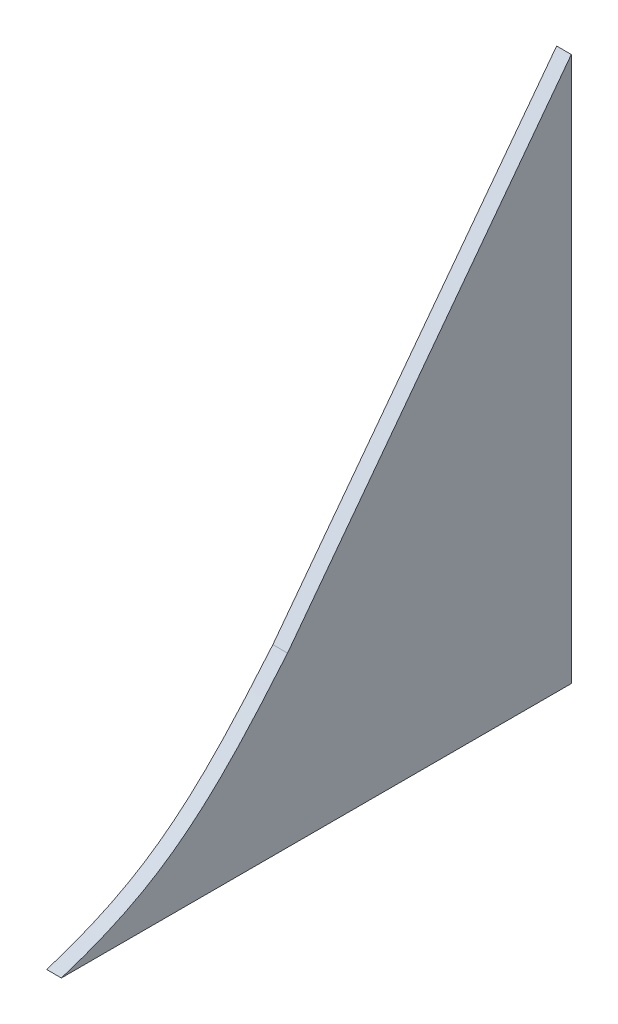
ISO-10303-21;
HEADER;
FILE_DESCRIPTION(('STEP AP214'),'2;1');
FILE_NAME('part.step','',(''),(''),'','','');
FILE_SCHEMA(('AUTOMOTIVE_DESIGN { 1 0 10303 214 1 1 1 1 }'));
ENDSEC;
DATA;
#1=APPLICATION_CONTEXT('core data for automotive mechanical design processes');
#2=APPLICATION_PROTOCOL_DEFINITION('international standard','automotive_design',2000,#1);
#3=PRODUCT_CONTEXT('',#1,'mechanical');
#4=PRODUCT('Part','Part','',(#3));
#5=PRODUCT_RELATED_PRODUCT_CATEGORY('part','',(#4));
#6=PRODUCT_DEFINITION_FORMATION('','',#4);
#7=PRODUCT_DEFINITION_CONTEXT('part definition',#1,'design');
#8=PRODUCT_DEFINITION('design','',#6,#7);
#9=PRODUCT_DEFINITION_SHAPE('','',#8);
#10=(LENGTH_UNIT() NAMED_UNIT(*) SI_UNIT(.MILLI.,.METRE.));
#11=(NAMED_UNIT(*) PLANE_ANGLE_UNIT() SI_UNIT($,.RADIAN.));
#12=(NAMED_UNIT(*) SI_UNIT($,.STERADIAN.) SOLID_ANGLE_UNIT());
#13=UNCERTAINTY_MEASURE_WITH_UNIT(LENGTH_MEASURE(1.E-05),#10,'distance_accuracy_value','');
#14=(GEOMETRIC_REPRESENTATION_CONTEXT(3) GLOBAL_UNCERTAINTY_ASSIGNED_CONTEXT((#13)) GLOBAL_UNIT_ASSIGNED_CONTEXT((#10,
#11,#12)) REPRESENTATION_CONTEXT('',''));
#15=CARTESIAN_POINT('',(0.,0.,0.));
#16=DIRECTION('',(0.,0.,1.));
#17=DIRECTION('',(1.,0.,0.));
#18=AXIS2_PLACEMENT_3D('',#15,#16,#17);
#19=CARTESIAN_POINT('',(2.667,99.06,114.3));
#20=DIRECTION('',(0.,-0.601815023152049,-0.798635510047292));
#21=DIRECTION('',(0.,0.798635510047292,-0.601815023152049));
#22=AXIS2_PLACEMENT_3D('',#19,#20,#21);
#23=PLANE('',#22);
#24=DIRECTION('',(0.,-0.798635510047292,0.601815023152049));
#25=VECTOR('',#24,1.);
#26=CARTESIAN_POINT('',(0.,99.06,114.3));
#27=LINE('',#26,#25);
#28=CARTESIAN_POINT('',(0.,99.06,114.3));
#29=VERTEX_POINT('',#28);
#30=CARTESIAN_POINT('',(0.,30.5969709011959,165.890592859709));
#31=VERTEX_POINT('',#30);
#32=EDGE_CURVE('E98',#29,#31,#27,.T.);
#33=ORIENTED_EDGE('',*,*,#32,.T.);
#34=DIRECTION('',(-1.,0.,0.));
#35=VECTOR('',#34,1.);
#36=CARTESIAN_POINT('',(2.667,30.5969709011959,165.890592859709));
#37=LINE('',#36,#35);
#38=CARTESIAN_POINT('',(2.667,30.5969709011959,165.890592859709));
#39=VERTEX_POINT('',#38);
#40=EDGE_CURVE('E11',#39,#31,#37,.T.);
#41=ORIENTED_EDGE('',*,*,#40,.F.);
#42=DIRECTION('',(0.,-0.798635510047292,0.601815023152049));
#43=VECTOR('',#42,1.);
#44=CARTESIAN_POINT('',(2.667,99.06,114.3));
#45=LINE('',#44,#43);
#46=CARTESIAN_POINT('',(2.667,99.06,114.3));
#47=VERTEX_POINT('',#46);
#48=EDGE_CURVE('E83',#47,#39,#45,.T.);
#49=ORIENTED_EDGE('',*,*,#48,.F.);
#50=DIRECTION('',(-1.,0.,0.));
#51=VECTOR('',#50,1.);
#52=CARTESIAN_POINT('',(2.667,99.06,114.3));
#53=LINE('',#52,#51);
#54=EDGE_CURVE('E91',#47,#29,#53,.T.);
#55=ORIENTED_EDGE('',*,*,#54,.T.);
#56=EDGE_LOOP('',(#33,#41,#49,#55));
#57=FACE_BOUND('',#56,.T.);
#58=ADVANCED_FACE('F32',(#57),#23,.F.);
#59=CARTESIAN_POINT('',(2.667,30.5969709011959,165.890592859709));
#60=CARTESIAN_POINT('',(2.667,13.6197186510497,180.09524478205));
#61=CARTESIAN_POINT('',(2.667,5.8017563901374,188.626978320469));
#62=CARTESIAN_POINT('',(2.667,0.,207.01));
#63=B_SPLINE_CURVE_WITH_KNOTS('',3,(#59,#60,#61,#62),.UNSPECIFIED.,.F.,.F.,(4,4),(0.,1.),.UNSPECIFIED.);
#64=DIRECTION('',(-1.,0.,0.));
#65=VECTOR('',#64,1.);
#66=SURFACE_OF_LINEAR_EXTRUSION('',#63,#65);
#67=CARTESIAN_POINT('',(0.,30.5969709011959,165.890592859709));
#68=CARTESIAN_POINT('',(0.,13.6197186510497,180.09524478205));
#69=CARTESIAN_POINT('',(0.,5.8017563901374,188.626978320469));
#70=CARTESIAN_POINT('',(0.,0.,207.01));
#71=B_SPLINE_CURVE_WITH_KNOTS('',3,(#67,#68,#69,#70),.UNSPECIFIED.,.F.,.F.,(4,4),(0.,1.),.UNSPECIFIED.);
#72=CARTESIAN_POINT('',(0.,0.,207.01));
#73=VERTEX_POINT('',#72);
#74=EDGE_CURVE('E87',#31,#73,#71,.T.);
#75=ORIENTED_EDGE('',*,*,#74,.T.);
#76=DIRECTION('',(-1.,0.,0.));
#77=VECTOR('',#76,1.);
#78=CARTESIAN_POINT('',(2.667,0.,207.01));
#79=LINE('',#78,#77);
#80=CARTESIAN_POINT('',(2.667,0.,207.01));
#81=VERTEX_POINT('',#80);
#82=EDGE_CURVE('E40',#81,#73,#79,.T.);
#83=ORIENTED_EDGE('',*,*,#82,.F.);
#84=EDGE_CURVE('E78',#39,#81,#63,.T.);
#85=ORIENTED_EDGE('',*,*,#84,.F.);
#86=ORIENTED_EDGE('',*,*,#40,.T.);
#87=EDGE_LOOP('',(#75,#83,#85,#86));
#88=FACE_BOUND('',#87,.T.);
#89=ADVANCED_FACE('F86',(#88),#66,.F.);
#90=CARTESIAN_POINT('',(2.667,0.,114.3));
#91=DIRECTION('',(0.,1.,0.));
#92=DIRECTION('',(0.,0.,1.));
#93=AXIS2_PLACEMENT_3D('',#90,#91,#92);
#94=PLANE('',#93);
#95=DIRECTION('',(0.,0.,-1.));
#96=VECTOR('',#95,1.);
#97=CARTESIAN_POINT('',(0.,0.,114.3));
#98=LINE('',#97,#96);
#99=CARTESIAN_POINT('',(0.,0.,114.3));
#100=VERTEX_POINT('',#99);
#101=EDGE_CURVE('E65',#73,#100,#98,.T.);
#102=ORIENTED_EDGE('',*,*,#101,.T.);
#103=DIRECTION('',(-1.,0.,0.));
#104=VECTOR('',#103,1.);
#105=CARTESIAN_POINT('',(2.667,0.,114.3));
#106=LINE('',#105,#104);
#107=CARTESIAN_POINT('',(2.667,0.,114.3));
#108=VERTEX_POINT('',#107);
#109=EDGE_CURVE('E88',#108,#100,#106,.T.);
#110=ORIENTED_EDGE('',*,*,#109,.F.);
#111=DIRECTION('',(0.,0.,-1.));
#112=VECTOR('',#111,1.);
#113=CARTESIAN_POINT('',(2.667,0.,114.3));
#114=LINE('',#113,#112);
#115=EDGE_CURVE('E81',#81,#108,#114,.T.);
#116=ORIENTED_EDGE('',*,*,#115,.F.);
#117=ORIENTED_EDGE('',*,*,#82,.T.);
#118=EDGE_LOOP('',(#102,#110,#116,#117));
#119=FACE_BOUND('',#118,.T.);
#120=ADVANCED_FACE('F89',(#119),#94,.F.);
#121=CARTESIAN_POINT('',(2.667,99.06,114.3));
#122=DIRECTION('',(0.,0.,1.));
#123=DIRECTION('',(0.,-1.,0.));
#124=AXIS2_PLACEMENT_3D('',#121,#122,#123);
#125=PLANE('',#124);
#126=DIRECTION('',(0.,1.,0.));
#127=VECTOR('',#126,1.);
#128=CARTESIAN_POINT('',(0.,99.06,114.3));
#129=LINE('',#128,#127);
#130=EDGE_CURVE('E71',#100,#29,#129,.T.);
#131=ORIENTED_EDGE('',*,*,#130,.T.);
#132=ORIENTED_EDGE('',*,*,#54,.F.);
#133=DIRECTION('',(0.,1.,0.));
#134=VECTOR('',#133,1.);
#135=CARTESIAN_POINT('',(2.667,99.06,114.3));
#136=LINE('',#135,#134);
#137=EDGE_CURVE('E48',#108,#47,#136,.T.);
#138=ORIENTED_EDGE('',*,*,#137,.F.);
#139=ORIENTED_EDGE('',*,*,#109,.T.);
#140=EDGE_LOOP('',(#131,#132,#138,#139));
#141=FACE_BOUND('',#140,.T.);
#142=ADVANCED_FACE('F110',(#141),#125,.F.);
#143=CARTESIAN_POINT('',(2.667,11.1076745030947,184.883407770908));
#144=DIRECTION('',(1.,0.,0.));
#145=DIRECTION('',(0.,0.,-1.));
#146=AXIS2_PLACEMENT_3D('',#143,#144,#145);
#147=PLANE('',#146);
#148=ORIENTED_EDGE('',*,*,#48,.T.);
#149=ORIENTED_EDGE('',*,*,#84,.T.);
#150=ORIENTED_EDGE('',*,*,#115,.T.);
#151=ORIENTED_EDGE('',*,*,#137,.T.);
#152=EDGE_LOOP('',(#148,#149,#150,#151));
#153=FACE_BOUND('',#152,.T.);
#154=ADVANCED_FACE('F79',(#153),#147,.T.);
#155=CARTESIAN_POINT('',(0.,11.1076745030947,184.883407770908));
#156=DIRECTION('',(1.,0.,0.));
#157=DIRECTION('',(0.,0.,-1.));
#158=AXIS2_PLACEMENT_3D('',#155,#156,#157);
#159=PLANE('',#158);
#160=ORIENTED_EDGE('',*,*,#32,.F.);
#161=ORIENTED_EDGE('',*,*,#130,.F.);
#162=ORIENTED_EDGE('',*,*,#101,.F.);
#163=ORIENTED_EDGE('',*,*,#74,.F.);
#164=EDGE_LOOP('',(#160,#161,#162,#163));
#165=FACE_BOUND('',#164,.T.);
#166=ADVANCED_FACE('F113',(#165),#159,.F.);
#167=CLOSED_SHELL('',(#58,#89,#120,#142,#154,#166));
#168=MANIFOLD_SOLID_BREP('B2',#167);
#169=ADVANCED_BREP_SHAPE_REPRESENTATION('',(#18,#168),#14);
#170=SHAPE_DEFINITION_REPRESENTATION(#9,#169);
ENDSEC;
END-ISO-10303-21;
